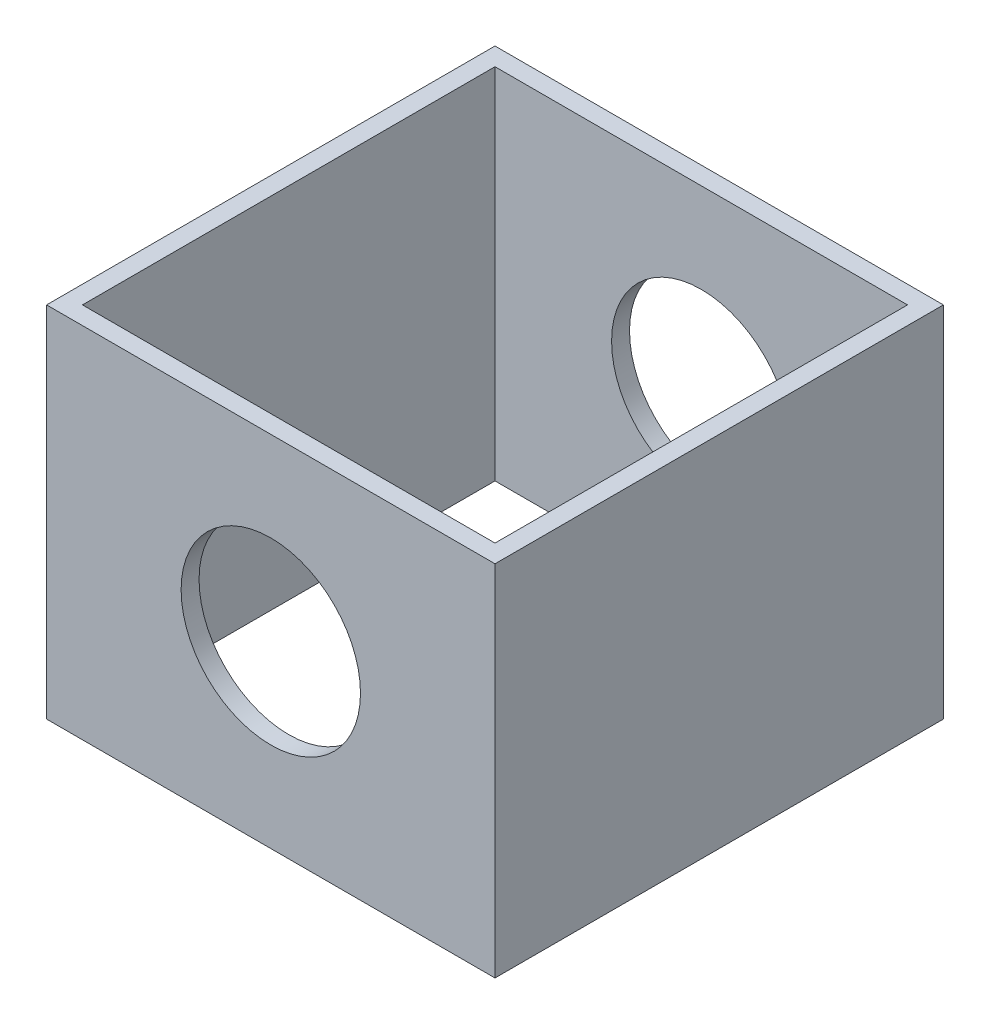
ISO-10303-21;
HEADER;
FILE_DESCRIPTION(('STEP AP214'),'2;1');
FILE_NAME('part.step','',(''),(''),'','','');
FILE_SCHEMA(('AUTOMOTIVE_DESIGN { 1 0 10303 214 1 1 1 1 }'));
ENDSEC;
DATA;
#1=APPLICATION_CONTEXT('core data for automotive mechanical design processes');
#2=APPLICATION_PROTOCOL_DEFINITION('international standard','automotive_design',2000,#1);
#3=PRODUCT_CONTEXT('',#1,'mechanical');
#4=PRODUCT('Part','Part','',(#3));
#5=PRODUCT_RELATED_PRODUCT_CATEGORY('part','',(#4));
#6=PRODUCT_DEFINITION_FORMATION('','',#4);
#7=PRODUCT_DEFINITION_CONTEXT('part definition',#1,'design');
#8=PRODUCT_DEFINITION('design','',#6,#7);
#9=PRODUCT_DEFINITION_SHAPE('','',#8);
#10=(LENGTH_UNIT() NAMED_UNIT(*) SI_UNIT(.MILLI.,.METRE.));
#11=(NAMED_UNIT(*) PLANE_ANGLE_UNIT() SI_UNIT($,.RADIAN.));
#12=(NAMED_UNIT(*) SI_UNIT($,.STERADIAN.) SOLID_ANGLE_UNIT());
#13=UNCERTAINTY_MEASURE_WITH_UNIT(LENGTH_MEASURE(1.E-05),#10,'distance_accuracy_value','');
#14=(GEOMETRIC_REPRESENTATION_CONTEXT(3) GLOBAL_UNCERTAINTY_ASSIGNED_CONTEXT((#13)) GLOBAL_UNIT_ASSIGNED_CONTEXT((#10,
#11,#12)) REPRESENTATION_CONTEXT('',''));
#15=CARTESIAN_POINT('',(0.,0.,0.));
#16=DIRECTION('',(0.,0.,1.));
#17=DIRECTION('',(1.,0.,0.));
#18=AXIS2_PLACEMENT_3D('',#15,#16,#17);
#19=CARTESIAN_POINT('',(0.,25.4,0.));
#20=DIRECTION('',(0.,-1.,0.));
#21=DIRECTION('',(0.,0.,-1.));
#22=AXIS2_PLACEMENT_3D('',#19,#20,#21);
#23=PLANE('',#22);
#24=DIRECTION('',(1.,0.,0.));
#25=VECTOR('',#24,1.);
#26=CARTESIAN_POINT('',(1.27,25.4,1.27));
#27=LINE('',#26,#25);
#28=CARTESIAN_POINT('',(-30.48,25.4,1.27));
#29=VERTEX_POINT('',#28);
#30=CARTESIAN_POINT('',(1.27,25.4,1.27));
#31=VERTEX_POINT('',#30);
#32=EDGE_CURVE('E137',#29,#31,#27,.T.);
#33=ORIENTED_EDGE('',*,*,#32,.T.);
#34=DIRECTION('',(0.,0.,-1.));
#35=VECTOR('',#34,1.);
#36=CARTESIAN_POINT('',(1.27,25.4,1.27));
#37=LINE('',#36,#35);
#38=CARTESIAN_POINT('',(1.27,25.4,-30.48));
#39=VERTEX_POINT('',#38);
#40=EDGE_CURVE('E140',#31,#39,#37,.T.);
#41=ORIENTED_EDGE('',*,*,#40,.T.);
#42=DIRECTION('',(-1.,0.,0.));
#43=VECTOR('',#42,1.);
#44=CARTESIAN_POINT('',(1.27,25.4,-30.48));
#45=LINE('',#44,#43);
#46=CARTESIAN_POINT('',(-30.48,25.4,-30.48));
#47=VERTEX_POINT('',#46);
#48=EDGE_CURVE('E143',#39,#47,#45,.T.);
#49=ORIENTED_EDGE('',*,*,#48,.T.);
#50=DIRECTION('',(0.,0.,1.));
#51=VECTOR('',#50,1.);
#52=CARTESIAN_POINT('',(-30.48,25.4,1.27));
#53=LINE('',#52,#51);
#54=EDGE_CURVE('E145',#47,#29,#53,.T.);
#55=ORIENTED_EDGE('',*,*,#54,.T.);
#56=EDGE_LOOP('',(#33,#41,#49,#55));
#57=FACE_BOUND('',#56,.T.);
#58=DIRECTION('',(0.,0.,-1.));
#59=VECTOR('',#58,1.);
#60=CARTESIAN_POINT('',(0.,25.4,0.));
#61=LINE('',#60,#59);
#62=CARTESIAN_POINT('',(0.,25.4,0.));
#63=VERTEX_POINT('',#62);
#64=CARTESIAN_POINT('',(0.,25.4,-29.21));
#65=VERTEX_POINT('',#64);
#66=EDGE_CURVE('E99',#63,#65,#61,.T.);
#67=ORIENTED_EDGE('',*,*,#66,.F.);
#68=DIRECTION('',(1.,0.,0.));
#69=VECTOR('',#68,1.);
#70=CARTESIAN_POINT('',(0.,25.4,0.));
#71=LINE('',#70,#69);
#72=CARTESIAN_POINT('',(-29.21,25.4,0.));
#73=VERTEX_POINT('',#72);
#74=EDGE_CURVE('E121',#73,#63,#71,.T.);
#75=ORIENTED_EDGE('',*,*,#74,.F.);
#76=DIRECTION('',(0.,0.,1.));
#77=VECTOR('',#76,1.);
#78=CARTESIAN_POINT('',(-29.21,25.4,0.));
#79=LINE('',#78,#77);
#80=CARTESIAN_POINT('',(-29.21,25.4,-29.21));
#81=VERTEX_POINT('',#80);
#82=EDGE_CURVE('E119',#81,#73,#79,.T.);
#83=ORIENTED_EDGE('',*,*,#82,.F.);
#84=DIRECTION('',(-1.,0.,0.));
#85=VECTOR('',#84,1.);
#86=CARTESIAN_POINT('',(0.,25.4,-29.21));
#87=LINE('',#86,#85);
#88=EDGE_CURVE('E107',#65,#81,#87,.T.);
#89=ORIENTED_EDGE('',*,*,#88,.F.);
#90=EDGE_LOOP('',(#67,#75,#83,#89));
#91=FACE_BOUND('',#90,.T.);
#92=ADVANCED_FACE('F33',(#57,#91),#23,.F.);
#93=CARTESIAN_POINT('',(0.,0.,0.));
#94=DIRECTION('',(0.,-1.,0.));
#95=DIRECTION('',(0.,0.,-1.));
#96=AXIS2_PLACEMENT_3D('',#93,#94,#95);
#97=PLANE('',#96);
#98=DIRECTION('',(1.,0.,0.));
#99=VECTOR('',#98,1.);
#100=CARTESIAN_POINT('',(1.27,0.,1.27));
#101=LINE('',#100,#99);
#102=CARTESIAN_POINT('',(-30.48,0.,1.27));
#103=VERTEX_POINT('',#102);
#104=CARTESIAN_POINT('',(1.27,0.,1.27));
#105=VERTEX_POINT('',#104);
#106=EDGE_CURVE('E115',#103,#105,#101,.T.);
#107=ORIENTED_EDGE('',*,*,#106,.F.);
#108=DIRECTION('',(0.,0.,1.));
#109=VECTOR('',#108,1.);
#110=CARTESIAN_POINT('',(-30.48,0.,1.27));
#111=LINE('',#110,#109);
#112=CARTESIAN_POINT('',(-30.48,0.,-30.48));
#113=VERTEX_POINT('',#112);
#114=EDGE_CURVE('E141',#113,#103,#111,.T.);
#115=ORIENTED_EDGE('',*,*,#114,.F.);
#116=DIRECTION('',(-1.,0.,0.));
#117=VECTOR('',#116,1.);
#118=CARTESIAN_POINT('',(1.27,0.,-30.48));
#119=LINE('',#118,#117);
#120=CARTESIAN_POINT('',(1.27,0.,-30.48));
#121=VERTEX_POINT('',#120);
#122=EDGE_CURVE('E152',#121,#113,#119,.T.);
#123=ORIENTED_EDGE('',*,*,#122,.F.);
#124=DIRECTION('',(0.,0.,-1.));
#125=VECTOR('',#124,1.);
#126=CARTESIAN_POINT('',(1.27,0.,1.27));
#127=LINE('',#126,#125);
#128=EDGE_CURVE('E150',#105,#121,#127,.T.);
#129=ORIENTED_EDGE('',*,*,#128,.F.);
#130=EDGE_LOOP('',(#107,#115,#123,#129));
#131=FACE_BOUND('',#130,.T.);
#132=DIRECTION('',(1.,0.,0.));
#133=VECTOR('',#132,1.);
#134=CARTESIAN_POINT('',(0.,0.,0.));
#135=LINE('',#134,#133);
#136=CARTESIAN_POINT('',(-29.21,0.,0.));
#137=VERTEX_POINT('',#136);
#138=CARTESIAN_POINT('',(0.,0.,0.));
#139=VERTEX_POINT('',#138);
#140=EDGE_CURVE('E108',#137,#139,#135,.T.);
#141=ORIENTED_EDGE('',*,*,#140,.T.);
#142=DIRECTION('',(0.,0.,-1.));
#143=VECTOR('',#142,1.);
#144=CARTESIAN_POINT('',(0.,0.,0.));
#145=LINE('',#144,#143);
#146=CARTESIAN_POINT('',(0.,0.,-29.21));
#147=VERTEX_POINT('',#146);
#148=EDGE_CURVE('E57',#139,#147,#145,.T.);
#149=ORIENTED_EDGE('',*,*,#148,.T.);
#150=DIRECTION('',(-1.,0.,0.));
#151=VECTOR('',#150,1.);
#152=CARTESIAN_POINT('',(0.,0.,-29.21));
#153=LINE('',#152,#151);
#154=CARTESIAN_POINT('',(-29.21,0.,-29.21));
#155=VERTEX_POINT('',#154);
#156=EDGE_CURVE('E114',#147,#155,#153,.T.);
#157=ORIENTED_EDGE('',*,*,#156,.T.);
#158=DIRECTION('',(0.,0.,1.));
#159=VECTOR('',#158,1.);
#160=CARTESIAN_POINT('',(-29.21,0.,0.));
#161=LINE('',#160,#159);
#162=EDGE_CURVE('E129',#155,#137,#161,.T.);
#163=ORIENTED_EDGE('',*,*,#162,.T.);
#164=EDGE_LOOP('',(#141,#149,#157,#163));
#165=FACE_BOUND('',#164,.T.);
#166=ADVANCED_FACE('F171',(#131,#165),#97,.T.);
#167=CARTESIAN_POINT('',(1.27,25.4,1.27));
#168=DIRECTION('',(0.,0.,-1.));
#169=DIRECTION('',(-1.,0.,0.));
#170=AXIS2_PLACEMENT_3D('',#167,#168,#169);
#171=PLANE('',#170);
#172=CARTESIAN_POINT('',(-14.605,12.7,1.27));
#173=DIRECTION('',(0.,0.,1.));
#174=DIRECTION('',(1.,0.,0.));
#175=AXIS2_PLACEMENT_3D('',#172,#173,#174);
#176=CIRCLE('',#175,6.35);
#177=CARTESIAN_POINT('',(-8.255,12.7,1.27));
#178=VERTEX_POINT('',#177);
#179=EDGE_CURVE('E232',#178,#178,#176,.T.);
#180=ORIENTED_EDGE('',*,*,#179,.F.);
#181=EDGE_LOOP('',(#180));
#182=FACE_BOUND('',#181,.T.);
#183=ORIENTED_EDGE('',*,*,#106,.T.);
#184=DIRECTION('',(0.,-1.,0.));
#185=VECTOR('',#184,1.);
#186=CARTESIAN_POINT('',(1.27,25.4,1.27));
#187=LINE('',#186,#185);
#188=EDGE_CURVE('E11',#31,#105,#187,.T.);
#189=ORIENTED_EDGE('',*,*,#188,.F.);
#190=ORIENTED_EDGE('',*,*,#32,.F.);
#191=DIRECTION('',(0.,-1.,0.));
#192=VECTOR('',#191,1.);
#193=CARTESIAN_POINT('',(-30.48,25.4,1.27));
#194=LINE('',#193,#192);
#195=EDGE_CURVE('E147',#29,#103,#194,.T.);
#196=ORIENTED_EDGE('',*,*,#195,.T.);
#197=EDGE_LOOP('',(#183,#189,#190,#196));
#198=FACE_BOUND('',#197,.T.);
#199=ADVANCED_FACE('F35',(#182,#198),#171,.F.);
#200=CARTESIAN_POINT('',(1.27,25.4,1.27));
#201=DIRECTION('',(-1.,0.,0.));
#202=DIRECTION('',(0.,0.,1.));
#203=AXIS2_PLACEMENT_3D('',#200,#201,#202);
#204=PLANE('',#203);
#205=ORIENTED_EDGE('',*,*,#128,.T.);
#206=DIRECTION('',(0.,-1.,0.));
#207=VECTOR('',#206,1.);
#208=CARTESIAN_POINT('',(1.27,25.4,-30.48));
#209=LINE('',#208,#207);
#210=EDGE_CURVE('E42',#39,#121,#209,.T.);
#211=ORIENTED_EDGE('',*,*,#210,.F.);
#212=ORIENTED_EDGE('',*,*,#40,.F.);
#213=ORIENTED_EDGE('',*,*,#188,.T.);
#214=EDGE_LOOP('',(#205,#211,#212,#213));
#215=FACE_BOUND('',#214,.T.);
#216=ADVANCED_FACE('F181',(#215),#204,.F.);
#217=CARTESIAN_POINT('',(1.27,25.4,-30.48));
#218=DIRECTION('',(0.,0.,1.));
#219=DIRECTION('',(1.,0.,0.));
#220=AXIS2_PLACEMENT_3D('',#217,#218,#219);
#221=PLANE('',#220);
#222=CARTESIAN_POINT('',(-14.605,12.7,-30.48));
#223=DIRECTION('',(0.,0.,1.));
#224=DIRECTION('',(1.,0.,0.));
#225=AXIS2_PLACEMENT_3D('',#222,#223,#224);
#226=CIRCLE('',#225,6.35);
#227=CARTESIAN_POINT('',(-8.255,12.7,-30.48));
#228=VERTEX_POINT('',#227);
#229=EDGE_CURVE('E233',#228,#228,#226,.F.);
#230=ORIENTED_EDGE('',*,*,#229,.F.);
#231=EDGE_LOOP('',(#230));
#232=FACE_BOUND('',#231,.T.);
#233=ORIENTED_EDGE('',*,*,#122,.T.);
#234=DIRECTION('',(0.,-1.,0.));
#235=VECTOR('',#234,1.);
#236=CARTESIAN_POINT('',(-30.48,25.4,-30.48));
#237=LINE('',#236,#235);
#238=EDGE_CURVE('E157',#47,#113,#237,.T.);
#239=ORIENTED_EDGE('',*,*,#238,.F.);
#240=ORIENTED_EDGE('',*,*,#48,.F.);
#241=ORIENTED_EDGE('',*,*,#210,.T.);
#242=EDGE_LOOP('',(#233,#239,#240,#241));
#243=FACE_BOUND('',#242,.T.);
#244=ADVANCED_FACE('F165',(#232,#243),#221,.F.);
#245=CARTESIAN_POINT('',(-30.48,25.4,1.27));
#246=DIRECTION('',(1.,0.,0.));
#247=DIRECTION('',(0.,0.,-1.));
#248=AXIS2_PLACEMENT_3D('',#245,#246,#247);
#249=PLANE('',#248);
#250=ORIENTED_EDGE('',*,*,#114,.T.);
#251=ORIENTED_EDGE('',*,*,#195,.F.);
#252=ORIENTED_EDGE('',*,*,#54,.F.);
#253=ORIENTED_EDGE('',*,*,#238,.T.);
#254=EDGE_LOOP('',(#250,#251,#252,#253));
#255=FACE_BOUND('',#254,.T.);
#256=ADVANCED_FACE('F175',(#255),#249,.F.);
#257=CARTESIAN_POINT('',(0.,25.4,0.));
#258=DIRECTION('',(-1.,0.,0.));
#259=DIRECTION('',(0.,0.,1.));
#260=AXIS2_PLACEMENT_3D('',#257,#258,#259);
#261=PLANE('',#260);
#262=ORIENTED_EDGE('',*,*,#148,.F.);
#263=DIRECTION('',(0.,-1.,0.));
#264=VECTOR('',#263,1.);
#265=CARTESIAN_POINT('',(0.,25.4,0.));
#266=LINE('',#265,#264);
#267=EDGE_CURVE('E103',#63,#139,#266,.T.);
#268=ORIENTED_EDGE('',*,*,#267,.F.);
#269=ORIENTED_EDGE('',*,*,#66,.T.);
#270=DIRECTION('',(0.,-1.,0.));
#271=VECTOR('',#270,1.);
#272=CARTESIAN_POINT('',(0.,25.4,-29.21));
#273=LINE('',#272,#271);
#274=EDGE_CURVE('E102',#65,#147,#273,.T.);
#275=ORIENTED_EDGE('',*,*,#274,.T.);
#276=EDGE_LOOP('',(#262,#268,#269,#275));
#277=FACE_BOUND('',#276,.T.);
#278=ADVANCED_FACE('F101',(#277),#261,.T.);
#279=CARTESIAN_POINT('',(0.,25.4,-29.21));
#280=DIRECTION('',(0.,0.,1.));
#281=DIRECTION('',(1.,0.,0.));
#282=AXIS2_PLACEMENT_3D('',#279,#280,#281);
#283=PLANE('',#282);
#284=CARTESIAN_POINT('',(-14.605,12.7,-29.21));
#285=DIRECTION('',(0.,0.,1.));
#286=DIRECTION('',(1.,0.,0.));
#287=AXIS2_PLACEMENT_3D('',#284,#285,#286);
#288=CIRCLE('',#287,6.35);
#289=CARTESIAN_POINT('',(-8.255,12.7,-29.21));
#290=VERTEX_POINT('',#289);
#291=EDGE_CURVE('E127',#290,#290,#288,.T.);
#292=ORIENTED_EDGE('',*,*,#291,.F.);
#293=EDGE_LOOP('',(#292));
#294=FACE_BOUND('',#293,.T.);
#295=ORIENTED_EDGE('',*,*,#156,.F.);
#296=ORIENTED_EDGE('',*,*,#274,.F.);
#297=ORIENTED_EDGE('',*,*,#88,.T.);
#298=DIRECTION('',(0.,-1.,0.));
#299=VECTOR('',#298,1.);
#300=CARTESIAN_POINT('',(-29.21,25.4,-29.21));
#301=LINE('',#300,#299);
#302=EDGE_CURVE('E116',#81,#155,#301,.T.);
#303=ORIENTED_EDGE('',*,*,#302,.T.);
#304=EDGE_LOOP('',(#295,#296,#297,#303));
#305=FACE_BOUND('',#304,.T.);
#306=ADVANCED_FACE('F111',(#294,#305),#283,.T.);
#307=CARTESIAN_POINT('',(-29.21,25.4,0.));
#308=DIRECTION('',(1.,0.,0.));
#309=DIRECTION('',(0.,0.,-1.));
#310=AXIS2_PLACEMENT_3D('',#307,#308,#309);
#311=PLANE('',#310);
#312=ORIENTED_EDGE('',*,*,#162,.F.);
#313=ORIENTED_EDGE('',*,*,#302,.F.);
#314=ORIENTED_EDGE('',*,*,#82,.T.);
#315=DIRECTION('',(0.,-1.,0.));
#316=VECTOR('',#315,1.);
#317=CARTESIAN_POINT('',(-29.21,25.4,0.));
#318=LINE('',#317,#316);
#319=EDGE_CURVE('E49',#73,#137,#318,.T.);
#320=ORIENTED_EDGE('',*,*,#319,.T.);
#321=EDGE_LOOP('',(#312,#313,#314,#320));
#322=FACE_BOUND('',#321,.T.);
#323=ADVANCED_FACE('F206',(#322),#311,.T.);
#324=CARTESIAN_POINT('',(0.,25.4,0.));
#325=DIRECTION('',(0.,0.,-1.));
#326=DIRECTION('',(-1.,0.,0.));
#327=AXIS2_PLACEMENT_3D('',#324,#325,#326);
#328=PLANE('',#327);
#329=CARTESIAN_POINT('',(-14.605,12.7,0.));
#330=DIRECTION('',(0.,0.,-1.));
#331=DIRECTION('',(-1.,0.,0.));
#332=AXIS2_PLACEMENT_3D('',#329,#330,#331);
#333=CIRCLE('',#332,6.35);
#334=CARTESIAN_POINT('',(-20.955,12.7,0.));
#335=VERTEX_POINT('',#334);
#336=EDGE_CURVE('E37',#335,#335,#333,.T.);
#337=ORIENTED_EDGE('',*,*,#336,.F.);
#338=EDGE_LOOP('',(#337));
#339=FACE_BOUND('',#338,.T.);
#340=ORIENTED_EDGE('',*,*,#140,.F.);
#341=ORIENTED_EDGE('',*,*,#319,.F.);
#342=ORIENTED_EDGE('',*,*,#74,.T.);
#343=ORIENTED_EDGE('',*,*,#267,.T.);
#344=EDGE_LOOP('',(#340,#341,#342,#343));
#345=FACE_BOUND('',#344,.T.);
#346=ADVANCED_FACE('F211',(#339,#345),#328,.T.);
#347=CARTESIAN_POINT('',(-14.605,12.7,-48.4405122421383));
#348=DIRECTION('',(0.,0.,1.));
#349=DIRECTION('',(1.,0.,0.));
#350=AXIS2_PLACEMENT_3D('',#347,#348,#349);
#351=CYLINDRICAL_SURFACE('',#350,6.35);
#352=ORIENTED_EDGE('',*,*,#336,.T.);
#353=EDGE_LOOP('',(#352));
#354=FACE_BOUND('',#353,.T.);
#355=ORIENTED_EDGE('',*,*,#179,.T.);
#356=EDGE_LOOP('',(#355));
#357=FACE_BOUND('',#356,.T.);
#358=ADVANCED_FACE('F218',(#354,#357),#351,.F.);
#359=ORIENTED_EDGE('',*,*,#291,.T.);
#360=EDGE_LOOP('',(#359));
#361=FACE_BOUND('',#360,.T.);
#362=ORIENTED_EDGE('',*,*,#229,.T.);
#363=EDGE_LOOP('',(#362));
#364=FACE_BOUND('',#363,.T.);
#365=ADVANCED_FACE('F221',(#361,#364),#351,.F.);
#366=CLOSED_SHELL('',(#92,#166,#199,#216,#244,#256,#278,#306,#323,#346,#358,#365));
#367=MANIFOLD_SOLID_BREP('B2',#366);
#368=ADVANCED_BREP_SHAPE_REPRESENTATION('',(#18,#367),#14);
#369=SHAPE_DEFINITION_REPRESENTATION(#9,#368);
ENDSEC;
END-ISO-10303-21;
